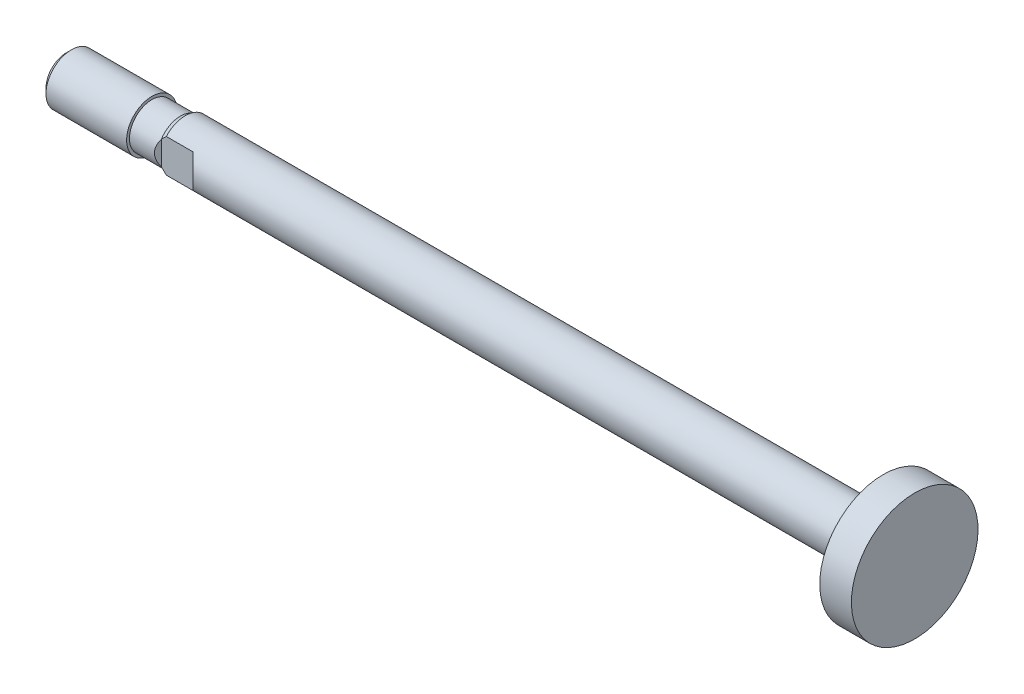
ISO-10303-21;
HEADER;
FILE_DESCRIPTION(('STEP AP214'),'2;1');
FILE_NAME('part.step','',(''),(''),'','','');
FILE_SCHEMA(('AUTOMOTIVE_DESIGN { 1 0 10303 214 1 1 1 1 }'));
ENDSEC;
DATA;
#1=APPLICATION_CONTEXT('core data for automotive mechanical design processes');
#2=APPLICATION_PROTOCOL_DEFINITION('international standard','automotive_design',2000,#1);
#3=PRODUCT_CONTEXT('',#1,'mechanical');
#4=PRODUCT('Part','Part','',(#3));
#5=PRODUCT_RELATED_PRODUCT_CATEGORY('part','',(#4));
#6=PRODUCT_DEFINITION_FORMATION('','',#4);
#7=PRODUCT_DEFINITION_CONTEXT('part definition',#1,'design');
#8=PRODUCT_DEFINITION('design','',#6,#7);
#9=PRODUCT_DEFINITION_SHAPE('','',#8);
#10=(LENGTH_UNIT() NAMED_UNIT(*) SI_UNIT(.MILLI.,.METRE.));
#11=(NAMED_UNIT(*) PLANE_ANGLE_UNIT() SI_UNIT($,.RADIAN.));
#12=(NAMED_UNIT(*) SI_UNIT($,.STERADIAN.) SOLID_ANGLE_UNIT());
#13=UNCERTAINTY_MEASURE_WITH_UNIT(LENGTH_MEASURE(1.E-05),#10,'distance_accuracy_value','');
#14=(GEOMETRIC_REPRESENTATION_CONTEXT(3) GLOBAL_UNCERTAINTY_ASSIGNED_CONTEXT((#13)) GLOBAL_UNIT_ASSIGNED_CONTEXT((#10,
#11,#12)) REPRESENTATION_CONTEXT('',''));
#15=CARTESIAN_POINT('',(0.,0.,0.));
#16=DIRECTION('',(0.,0.,1.));
#17=DIRECTION('',(1.,0.,0.));
#18=AXIS2_PLACEMENT_3D('',#15,#16,#17);
#19=CARTESIAN_POINT('',(-17.,0.,0.));
#20=DIRECTION('',(1.,0.,0.));
#21=DIRECTION('',(0.,1.,0.));
#22=AXIS2_PLACEMENT_3D('',#19,#20,#21);
#23=CONICAL_SURFACE('',#22,3.54999999999995,0.523598775598298);
#24=CARTESIAN_POINT('',(-17.,-1.89802528961009,3.));
#25=CARTESIAN_POINT('',(-16.7553873564581,-2.1621716506257,3.));
#26=CARTESIAN_POINT('',(-16.4917996718226,-2.40900887337637,3.));
#27=CARTESIAN_POINT('',(-16.220577136594,-2.6457513110645,3.));
#28=B_SPLINE_CURVE_WITH_KNOTS('',3,(#24,#25,#26,#27),.UNSPECIFIED.,.F.,.F.,(4,4),(0.,1.),.UNSPECIFIED.);
#29=CARTESIAN_POINT('',(-17.,-1.89802528961009,3.));
#30=VERTEX_POINT('',#29);
#31=CARTESIAN_POINT('',(-16.220577136594,-2.64575131106452,3.00000000000002));
#32=VERTEX_POINT('',#31);
#33=EDGE_CURVE('E118',#30,#32,#28,.T.);
#34=ORIENTED_EDGE('',*,*,#33,.F.);
#35=CARTESIAN_POINT('',(-17.,0.,0.));
#36=DIRECTION('',(1.,0.,0.));
#37=DIRECTION('',(0.,1.,0.));
#38=AXIS2_PLACEMENT_3D('',#35,#36,#37);
#39=CIRCLE('',#38,3.54999999999995);
#40=CARTESIAN_POINT('',(-17.,-1.89802528961009,-3.));
#41=VERTEX_POINT('',#40);
#42=EDGE_CURVE('E346',#30,#41,#39,.T.);
#43=ORIENTED_EDGE('',*,*,#42,.T.);
#44=CARTESIAN_POINT('',(-16.220577136594,-2.64575131106451,-3.));
#45=CARTESIAN_POINT('',(-16.2814738305897,-2.59259631872018,-3.));
#46=CARTESIAN_POINT('',(-16.3423408017062,-2.53855972151849,-3.));
#47=CARTESIAN_POINT('',(-16.6091363729772,-2.29705236954332,-3.));
#48=CARTESIAN_POINT('',(-16.8104066054436,-2.10275880019047,-3.));
#49=CARTESIAN_POINT('',(-17.,-1.8980252896101,-3.));
#50=B_SPLINE_CURVE_WITH_KNOTS('',3,(#44,#45,#46,#47,#48,#49),.UNSPECIFIED.,.F.,.F.,(4,2,4),(0.,
0.224615915627958,1.),.UNSPECIFIED.);
#51=CARTESIAN_POINT('',(-16.220577136594,-2.64575131106451,-3.));
#52=VERTEX_POINT('',#51);
#53=EDGE_CURVE('E78',#52,#41,#50,.T.);
#54=ORIENTED_EDGE('',*,*,#53,.F.);
#55=CARTESIAN_POINT('',(-16.220577136594,0.,0.));
#56=DIRECTION('',(1.,0.,0.));
#57=DIRECTION('',(0.,1.,0.));
#58=AXIS2_PLACEMENT_3D('',#55,#56,#57);
#59=CIRCLE('',#58,3.99999999999995);
#60=EDGE_CURVE('E238',#32,#52,#59,.T.);
#61=ORIENTED_EDGE('',*,*,#60,.F.);
#62=EDGE_LOOP('',(#34,#43,#54,#61));
#63=FACE_BOUND('',#62,.T.);
#64=ADVANCED_FACE('F52',(#63),#23,.T.);
#65=CARTESIAN_POINT('',(-12.,18.,3.));
#66=DIRECTION('',(0.,0.,1.));
#67=DIRECTION('',(1.,0.,0.));
#68=AXIS2_PLACEMENT_3D('',#65,#66,#67);
#69=PLANE('',#68);
#70=ORIENTED_EDGE('',*,*,#33,.T.);
#71=DIRECTION('',(-1.,0.,0.));
#72=VECTOR('',#71,1.);
#73=CARTESIAN_POINT('',(-12.,-2.64575131106452,3.00000000000002));
#74=LINE('',#73,#72);
#75=CARTESIAN_POINT('',(-12.,-2.64575131106452,3.00000000000002));
#76=VERTEX_POINT('',#75);
#77=EDGE_CURVE('E111',#76,#32,#74,.T.);
#78=ORIENTED_EDGE('',*,*,#77,.F.);
#79=DIRECTION('',(0.,-1.,0.));
#80=VECTOR('',#79,1.);
#81=CARTESIAN_POINT('',(-12.,-2.64575131106452,3.00000000000002));
#82=LINE('',#81,#80);
#83=CARTESIAN_POINT('',(-12.,2.64575131106462,3.00000000000002));
#84=VERTEX_POINT('',#83);
#85=EDGE_CURVE('E115',#84,#76,#82,.T.);
#86=ORIENTED_EDGE('',*,*,#85,.F.);
#87=DIRECTION('',(-1.,0.,0.));
#88=VECTOR('',#87,1.);
#89=CARTESIAN_POINT('',(-12.,2.64575131106462,3.00000000000002));
#90=LINE('',#89,#88);
#91=CARTESIAN_POINT('',(-16.220577136594,2.64575131106462,3.00000000000002));
#92=VERTEX_POINT('',#91);
#93=EDGE_CURVE('E124',#84,#92,#90,.T.);
#94=ORIENTED_EDGE('',*,*,#93,.T.);
#95=CARTESIAN_POINT('',(-16.220577136594,2.6457513110646,3.));
#96=CARTESIAN_POINT('',(-16.2814738305897,2.59259631872027,3.));
#97=CARTESIAN_POINT('',(-16.3423408017062,2.53855972151858,3.));
#98=CARTESIAN_POINT('',(-16.6091363729772,2.29705236954341,3.));
#99=CARTESIAN_POINT('',(-16.8104066054436,2.10275880019057,3.));
#100=CARTESIAN_POINT('',(-17.,1.89802528961018,3.));
#101=B_SPLINE_CURVE_WITH_KNOTS('',3,(#95,#96,#97,#98,#99,#100),.UNSPECIFIED.,.F.,.F.,(4,2,4),
(0.,0.224615915627958,1.),.UNSPECIFIED.);
#102=CARTESIAN_POINT('',(-17.,1.89802528961019,3.));
#103=VERTEX_POINT('',#102);
#104=EDGE_CURVE('E153',#92,#103,#101,.T.);
#105=ORIENTED_EDGE('',*,*,#104,.T.);
#106=DIRECTION('',(0.,-1.,0.));
#107=VECTOR('',#106,1.);
#108=CARTESIAN_POINT('',(-17.,18.,3.));
#109=LINE('',#108,#107);
#110=EDGE_CURVE('E150',#103,#30,#109,.T.);
#111=ORIENTED_EDGE('',*,*,#110,.T.);
#112=EDGE_LOOP('',(#70,#78,#86,#94,#105,#111));
#113=FACE_BOUND('',#112,.T.);
#114=ADVANCED_FACE('F113',(#113),#69,.T.);
#115=CARTESIAN_POINT('',(-17.,0.,0.));
#116=DIRECTION('',(1.,0.,0.));
#117=DIRECTION('',(0.,-1.,0.));
#118=AXIS2_PLACEMENT_3D('',#115,#116,#117);
#119=CONICAL_SURFACE('',#118,3.54999999999995,0.523598775598298);
#120=CARTESIAN_POINT('',(-17.,1.89802528961018,-3.));
#121=CARTESIAN_POINT('',(-16.7553873564581,2.16217165062579,-3.));
#122=CARTESIAN_POINT('',(-16.4917996718226,2.40900887337646,-3.));
#123=CARTESIAN_POINT('',(-16.220577136594,2.6457513110646,-3.));
#124=B_SPLINE_CURVE_WITH_KNOTS('',3,(#120,#121,#122,#123),.UNSPECIFIED.,.F.,.F.,(4,4),(0.,1.),.UNSPECIFIED.);
#125=CARTESIAN_POINT('',(-17.,1.89802528961019,-3.));
#126=VERTEX_POINT('',#125);
#127=CARTESIAN_POINT('',(-16.220577136594,2.64575131106462,-3.00000000000002));
#128=VERTEX_POINT('',#127);
#129=EDGE_CURVE('E69',#126,#128,#124,.T.);
#130=ORIENTED_EDGE('',*,*,#129,.F.);
#131=CARTESIAN_POINT('',(-17.,0.,0.));
#132=DIRECTION('',(1.,0.,0.));
#133=DIRECTION('',(0.,1.,0.));
#134=AXIS2_PLACEMENT_3D('',#131,#132,#133);
#135=CIRCLE('',#134,3.54999999999995);
#136=EDGE_CURVE('E154',#126,#103,#135,.T.);
#137=ORIENTED_EDGE('',*,*,#136,.T.);
#138=ORIENTED_EDGE('',*,*,#104,.F.);
#139=CARTESIAN_POINT('',(-16.220577136594,0.,0.));
#140=DIRECTION('',(1.,0.,0.));
#141=DIRECTION('',(0.,1.,0.));
#142=AXIS2_PLACEMENT_3D('',#139,#140,#141);
#143=CIRCLE('',#142,3.99999999999995);
#144=EDGE_CURVE('E295',#128,#92,#143,.T.);
#145=ORIENTED_EDGE('',*,*,#144,.F.);
#146=EDGE_LOOP('',(#130,#137,#138,#145));
#147=FACE_BOUND('',#146,.T.);
#148=ADVANCED_FACE('F209',(#147),#119,.T.);
#149=CARTESIAN_POINT('',(-17.,18.,-3.));
#150=DIRECTION('',(0.,0.,-1.));
#151=DIRECTION('',(-1.,0.,0.));
#152=AXIS2_PLACEMENT_3D('',#149,#150,#151);
#153=PLANE('',#152);
#154=ORIENTED_EDGE('',*,*,#129,.T.);
#155=DIRECTION('',(-1.,0.,0.));
#156=VECTOR('',#155,1.);
#157=CARTESIAN_POINT('',(-12.,2.64575131106462,-3.00000000000002));
#158=LINE('',#157,#156);
#159=CARTESIAN_POINT('',(-12.,2.64575131106462,-3.00000000000002));
#160=VERTEX_POINT('',#159);
#161=EDGE_CURVE('E381',#160,#128,#158,.T.);
#162=ORIENTED_EDGE('',*,*,#161,.F.);
#163=DIRECTION('',(0.,1.,0.));
#164=VECTOR('',#163,1.);
#165=CARTESIAN_POINT('',(-12.,2.64575131106462,-3.00000000000002));
#166=LINE('',#165,#164);
#167=CARTESIAN_POINT('',(-12.,-2.64575131106451,-3.));
#168=VERTEX_POINT('',#167);
#169=EDGE_CURVE('E130',#168,#160,#166,.T.);
#170=ORIENTED_EDGE('',*,*,#169,.F.);
#171=DIRECTION('',(-1.,0.,0.));
#172=VECTOR('',#171,1.);
#173=CARTESIAN_POINT('',(-12.,-2.64575131106451,-3.));
#174=LINE('',#173,#172);
#175=EDGE_CURVE('E387',#168,#52,#174,.T.);
#176=ORIENTED_EDGE('',*,*,#175,.T.);
#177=ORIENTED_EDGE('',*,*,#53,.T.);
#178=DIRECTION('',(0.,-1.,0.));
#179=VECTOR('',#178,1.);
#180=CARTESIAN_POINT('',(-17.,18.,-3.));
#181=LINE('',#180,#179);
#182=EDGE_CURVE('E401',#126,#41,#181,.T.);
#183=ORIENTED_EDGE('',*,*,#182,.F.);
#184=EDGE_LOOP('',(#154,#162,#170,#176,#177,#183));
#185=FACE_BOUND('',#184,.T.);
#186=ADVANCED_FACE('F198',(#185),#153,.T.);
#187=CARTESIAN_POINT('',(-17.,18.,-3.));
#188=DIRECTION('',(0.707106781186545,0.,-0.70710678118655));
#189=DIRECTION('',(-0.70710678118655,0.,-0.707106781186545));
#190=AXIS2_PLACEMENT_3D('',#187,#188,#189);
#191=PLANE('',#190);
#192=CARTESIAN_POINT('',(-14.,0.,0.));
#193=DIRECTION('',(0.707106781186545,0.,-0.70710678118655));
#194=DIRECTION('',(0.70710678118655,0.,0.707106781186545));
#195=AXIS2_PLACEMENT_3D('',#192,#193,#194);
#196=ELLIPSE('',#195,5.02045814642443,3.54999999999995);
#197=EDGE_CURVE('E392',#126,#41,#196,.F.);
#198=ORIENTED_EDGE('',*,*,#197,.F.);
#199=ORIENTED_EDGE('',*,*,#182,.T.);
#200=EDGE_LOOP('',(#198,#199));
#201=FACE_BOUND('',#200,.T.);
#202=ADVANCED_FACE('F208',(#201),#191,.T.);
#203=CARTESIAN_POINT('',(-19.5,0.,0.));
#204=DIRECTION('',(1.,0.,0.));
#205=DIRECTION('',(0.,1.,0.));
#206=AXIS2_PLACEMENT_3D('',#203,#204,#205);
#207=CYLINDRICAL_SURFACE('',#206,3.54999999999995);
#208=CARTESIAN_POINT('',(-14.,0.,0.));
#209=DIRECTION('',(0.707106781186545,0.,0.70710678118655));
#210=DIRECTION('',(0.70710678118655,0.,-0.707106781186545));
#211=AXIS2_PLACEMENT_3D('',#208,#209,#210);
#212=ELLIPSE('',#211,5.02045814642443,3.54999999999995);
#213=EDGE_CURVE('E157',#30,#103,#212,.F.);
#214=ORIENTED_EDGE('',*,*,#213,.T.);
#215=ORIENTED_EDGE('',*,*,#136,.F.);
#216=ORIENTED_EDGE('',*,*,#197,.T.);
#217=ORIENTED_EDGE('',*,*,#42,.F.);
#218=EDGE_LOOP('',(#214,#215,#216,#217));
#219=FACE_BOUND('',#218,.T.);
#220=CARTESIAN_POINT('',(-21.5,0.,0.));
#221=DIRECTION('',(1.,0.,0.));
#222=DIRECTION('',(0.,0.,-1.));
#223=AXIS2_PLACEMENT_3D('',#220,#221,#222);
#224=CIRCLE('',#223,3.54999999999995);
#225=CARTESIAN_POINT('',(-21.5,0.,-3.54999999999995));
#226=VERTEX_POINT('',#225);
#227=EDGE_CURVE('E449',#226,#226,#224,.T.);
#228=ORIENTED_EDGE('',*,*,#227,.T.);
#229=EDGE_LOOP('',(#228));
#230=FACE_BOUND('',#229,.T.);
#231=ADVANCED_FACE('F211',(#219,#230),#207,.T.);
#232=CARTESIAN_POINT('',(-17.,18.,3.));
#233=DIRECTION('',(0.707106781186545,0.,0.70710678118655));
#234=DIRECTION('',(0.70710678118655,0.,-0.707106781186545));
#235=AXIS2_PLACEMENT_3D('',#232,#233,#234);
#236=PLANE('',#235);
#237=ORIENTED_EDGE('',*,*,#110,.F.);
#238=ORIENTED_EDGE('',*,*,#213,.F.);
#239=EDGE_LOOP('',(#237,#238));
#240=FACE_BOUND('',#239,.T.);
#241=ADVANCED_FACE('F417',(#240),#236,.T.);
#242=CARTESIAN_POINT('',(-12.,0.,0.));
#243=DIRECTION('',(-1.,0.,0.));
#244=DIRECTION('',(0.,-1.,0.));
#245=AXIS2_PLACEMENT_3D('',#242,#243,#244);
#246=CYLINDRICAL_SURFACE('',#245,3.99999999999999);
#247=ORIENTED_EDGE('',*,*,#60,.T.);
#248=ORIENTED_EDGE('',*,*,#175,.F.);
#249=CARTESIAN_POINT('',(-15.,0.,0.));
#250=DIRECTION('',(-0.707106781186545,0.,-0.70710678118655));
#251=DIRECTION('',(-0.70710678118655,0.,0.707106781186545));
#252=AXIS2_PLACEMENT_3D('',#249,#250,#251);
#253=ELLIPSE('',#252,5.65685424949238,3.99999999999999);
#254=EDGE_CURVE('E137',#168,#160,#253,.F.);
#255=ORIENTED_EDGE('',*,*,#254,.T.);
#256=ORIENTED_EDGE('',*,*,#161,.T.);
#257=ORIENTED_EDGE('',*,*,#144,.T.);
#258=ORIENTED_EDGE('',*,*,#93,.F.);
#259=CARTESIAN_POINT('',(-15.,0.,0.));
#260=DIRECTION('',(-0.707106781186545,0.,0.70710678118655));
#261=DIRECTION('',(-0.70710678118655,0.,-0.707106781186545));
#262=AXIS2_PLACEMENT_3D('',#259,#260,#261);
#263=ELLIPSE('',#262,5.65685424949238,3.99999999999999);
#264=EDGE_CURVE('E128',#84,#76,#263,.F.);
#265=ORIENTED_EDGE('',*,*,#264,.T.);
#266=ORIENTED_EDGE('',*,*,#77,.T.);
#267=EDGE_LOOP('',(#247,#248,#255,#256,#257,#258,#265,#266));
#268=FACE_BOUND('',#267,.T.);
#269=CARTESIAN_POINT('',(94.,0.,0.));
#270=DIRECTION('',(1.,0.,0.));
#271=DIRECTION('',(0.,1.,0.));
#272=AXIS2_PLACEMENT_3D('',#269,#270,#271);
#273=CIRCLE('',#272,4.);
#274=CARTESIAN_POINT('',(94.,4.,0.));
#275=VERTEX_POINT('',#274);
#276=EDGE_CURVE('E136',#275,#275,#273,.T.);
#277=ORIENTED_EDGE('',*,*,#276,.F.);
#278=EDGE_LOOP('',(#277));
#279=FACE_BOUND('',#278,.T.);
#280=ADVANCED_FACE('F132',(#268,#279),#246,.T.);
#281=CARTESIAN_POINT('',(-12.,2.64575131106462,-3.00000000000002));
#282=DIRECTION('',(-0.707106781186545,0.,-0.70710678118655));
#283=DIRECTION('',(-0.70710678118655,0.,0.707106781186545));
#284=AXIS2_PLACEMENT_3D('',#281,#282,#283);
#285=PLANE('',#284);
#286=ORIENTED_EDGE('',*,*,#254,.F.);
#287=ORIENTED_EDGE('',*,*,#169,.T.);
#288=EDGE_LOOP('',(#286,#287));
#289=FACE_BOUND('',#288,.T.);
#290=ADVANCED_FACE('F435',(#289),#285,.T.);
#291=CARTESIAN_POINT('',(-12.,-2.64575131106452,3.00000000000002));
#292=DIRECTION('',(-0.707106781186545,0.,0.70710678118655));
#293=DIRECTION('',(0.70710678118655,0.,0.707106781186545));
#294=AXIS2_PLACEMENT_3D('',#291,#292,#293);
#295=PLANE('',#294);
#296=ORIENTED_EDGE('',*,*,#264,.F.);
#297=ORIENTED_EDGE('',*,*,#85,.T.);
#298=EDGE_LOOP('',(#296,#297));
#299=FACE_BOUND('',#298,.T.);
#300=ADVANCED_FACE('F127',(#299),#295,.T.);
#301=CARTESIAN_POINT('',(99.,0.,0.));
#302=DIRECTION('',(-1.,0.,0.));
#303=DIRECTION('',(0.,-1.,0.));
#304=AXIS2_PLACEMENT_3D('',#301,#302,#303);
#305=CYLINDRICAL_SURFACE('',#304,10.);
#306=CARTESIAN_POINT('',(99.,0.,0.));
#307=DIRECTION('',(-1.,0.,0.));
#308=DIRECTION('',(0.,1.,0.));
#309=AXIS2_PLACEMENT_3D('',#306,#307,#308);
#310=CIRCLE('',#309,10.);
#311=CARTESIAN_POINT('',(99.,10.,0.));
#312=VERTEX_POINT('',#311);
#313=EDGE_CURVE('E144',#312,#312,#310,.T.);
#314=ORIENTED_EDGE('',*,*,#313,.T.);
#315=EDGE_LOOP('',(#314));
#316=FACE_BOUND('',#315,.T.);
#317=CARTESIAN_POINT('',(94.,0.,0.));
#318=DIRECTION('',(-1.,0.,0.));
#319=DIRECTION('',(0.,1.,0.));
#320=AXIS2_PLACEMENT_3D('',#317,#318,#319);
#321=CIRCLE('',#320,10.);
#322=CARTESIAN_POINT('',(94.,10.,0.));
#323=VERTEX_POINT('',#322);
#324=EDGE_CURVE('E438',#323,#323,#321,.T.);
#325=ORIENTED_EDGE('',*,*,#324,.F.);
#326=EDGE_LOOP('',(#325));
#327=FACE_BOUND('',#326,.T.);
#328=ADVANCED_FACE('F488',(#316,#327),#305,.T.);
#329=CARTESIAN_POINT('',(99.,0.,0.));
#330=DIRECTION('',(1.,0.,0.));
#331=DIRECTION('',(0.,1.,0.));
#332=AXIS2_PLACEMENT_3D('',#329,#330,#331);
#333=PLANE('',#332);
#334=ORIENTED_EDGE('',*,*,#313,.F.);
#335=EDGE_LOOP('',(#334));
#336=FACE_BOUND('',#335,.T.);
#337=ADVANCED_FACE('F493',(#336),#333,.T.);
#338=CARTESIAN_POINT('',(94.,0.,0.));
#339=DIRECTION('',(1.,0.,0.));
#340=DIRECTION('',(0.,1.,0.));
#341=AXIS2_PLACEMENT_3D('',#338,#339,#340);
#342=PLANE('',#341);
#343=ORIENTED_EDGE('',*,*,#276,.T.);
#344=EDGE_LOOP('',(#343));
#345=FACE_BOUND('',#344,.T.);
#346=ORIENTED_EDGE('',*,*,#324,.T.);
#347=EDGE_LOOP('',(#346));
#348=FACE_BOUND('',#347,.T.);
#349=ADVANCED_FACE('F458',(#345,#348),#342,.F.);
#350=CARTESIAN_POINT('',(-21.5,0.,0.));
#351=DIRECTION('',(1.,0.,0.));
#352=DIRECTION('',(0.,0.,-1.));
#353=AXIS2_PLACEMENT_3D('',#350,#351,#352);
#354=PLANE('',#353);
#355=ORIENTED_EDGE('',*,*,#227,.F.);
#356=EDGE_LOOP('',(#355));
#357=FACE_BOUND('',#356,.T.);
#358=CARTESIAN_POINT('',(-21.5,0.,0.));
#359=DIRECTION('',(1.,0.,0.));
#360=DIRECTION('',(0.,0.,-1.));
#361=AXIS2_PLACEMENT_3D('',#358,#359,#360);
#362=CIRCLE('',#361,3.99999999999994);
#363=CARTESIAN_POINT('',(-21.5,0.,-3.99999999999994));
#364=VERTEX_POINT('',#363);
#365=EDGE_CURVE('E442',#364,#364,#362,.T.);
#366=ORIENTED_EDGE('',*,*,#365,.T.);
#367=EDGE_LOOP('',(#366));
#368=FACE_BOUND('',#367,.T.);
#369=ADVANCED_FACE('F454',(#357,#368),#354,.T.);
#370=CARTESIAN_POINT('',(-35.,0.,0.));
#371=DIRECTION('',(-1.,0.,0.));
#372=DIRECTION('',(0.,0.,1.));
#373=AXIS2_PLACEMENT_3D('',#370,#371,#372);
#374=PLANE('',#373);
#375=CARTESIAN_POINT('',(-35.,0.,0.));
#376=DIRECTION('',(-1.,0.,0.));
#377=DIRECTION('',(0.,0.,1.));
#378=AXIS2_PLACEMENT_3D('',#375,#376,#377);
#379=CIRCLE('',#378,3.23299999999992);
#380=CARTESIAN_POINT('',(-35.,0.,3.23299999999992));
#381=VERTEX_POINT('',#380);
#382=EDGE_CURVE('E13',#381,#381,#379,.T.);
#383=ORIENTED_EDGE('',*,*,#382,.T.);
#384=EDGE_LOOP('',(#383));
#385=FACE_BOUND('',#384,.T.);
#386=ADVANCED_FACE('F457',(#385),#374,.T.);
#387=CARTESIAN_POINT('',(-34.233,0.,0.));
#388=DIRECTION('',(1.,0.,0.));
#389=DIRECTION('',(0.,0.,-1.));
#390=AXIS2_PLACEMENT_3D('',#387,#388,#389);
#391=CONICAL_SURFACE('',#390,3.99999999999994,0.785398163397432);
#392=ORIENTED_EDGE('',*,*,#382,.F.);
#393=EDGE_LOOP('',(#392));
#394=FACE_BOUND('',#393,.T.);
#395=CARTESIAN_POINT('',(-34.233,0.,0.));
#396=DIRECTION('',(-1.,0.,0.));
#397=DIRECTION('',(0.,0.,1.));
#398=AXIS2_PLACEMENT_3D('',#395,#396,#397);
#399=CIRCLE('',#398,3.99999999999994);
#400=CARTESIAN_POINT('',(-34.233,0.,3.99999999999994));
#401=VERTEX_POINT('',#400);
#402=EDGE_CURVE('E62',#401,#401,#399,.F.);
#403=ORIENTED_EDGE('',*,*,#402,.F.);
#404=EDGE_LOOP('',(#403));
#405=FACE_BOUND('',#404,.T.);
#406=ADVANCED_FACE('F55',(#394,#405),#391,.T.);
#407=CARTESIAN_POINT('',(-35.,0.,0.));
#408=DIRECTION('',(1.,0.,0.));
#409=DIRECTION('',(0.,0.,-1.));
#410=AXIS2_PLACEMENT_3D('',#407,#408,#409);
#411=CYLINDRICAL_SURFACE('',#410,3.99999999999994);
#412=ORIENTED_EDGE('',*,*,#402,.T.);
#413=EDGE_LOOP('',(#412));
#414=FACE_BOUND('',#413,.T.);
#415=ORIENTED_EDGE('',*,*,#365,.F.);
#416=EDGE_LOOP('',(#415));
#417=FACE_BOUND('',#416,.T.);
#418=ADVANCED_FACE('F462',(#414,#417),#411,.T.);
#419=CLOSED_SHELL('',(#64,#114,#148,#186,#202,#231,#241,#280,#290,#300,#328,#337,#349,#369,#386,
#406,#418));
#420=MANIFOLD_SOLID_BREP('B2',#419);
#421=ADVANCED_BREP_SHAPE_REPRESENTATION('',(#18,#420),#14);
#422=SHAPE_DEFINITION_REPRESENTATION(#9,#421);
ENDSEC;
END-ISO-10303-21;
